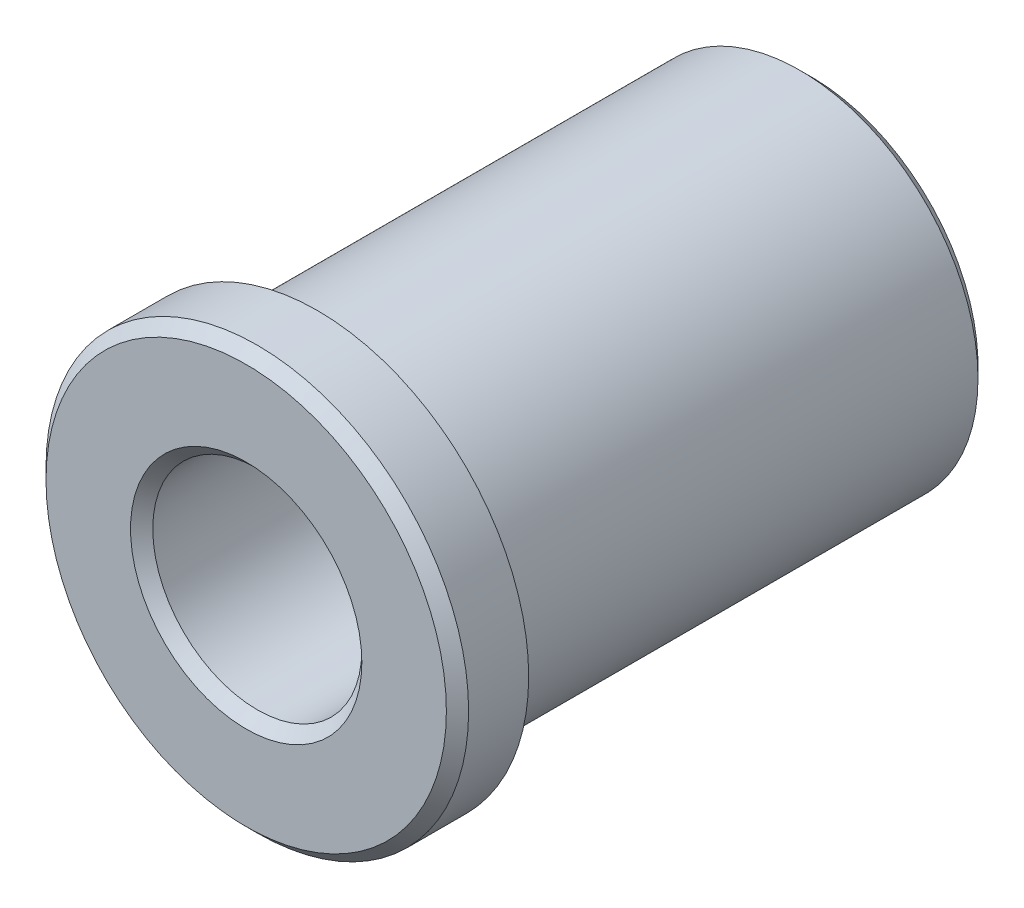
ISO-10303-21;
HEADER;
FILE_DESCRIPTION(('STEP AP214'),'2;1');
FILE_NAME('part.step','',(''),(''),'','','');
FILE_SCHEMA(('AUTOMOTIVE_DESIGN { 1 0 10303 214 1 1 1 1 }'));
ENDSEC;
DATA;
#1=APPLICATION_CONTEXT('core data for automotive mechanical design processes');
#2=APPLICATION_PROTOCOL_DEFINITION('international standard','automotive_design',2000,#1);
#3=PRODUCT_CONTEXT('',#1,'mechanical');
#4=PRODUCT('Part','Part','',(#3));
#5=PRODUCT_RELATED_PRODUCT_CATEGORY('part','',(#4));
#6=PRODUCT_DEFINITION_FORMATION('','',#4);
#7=PRODUCT_DEFINITION_CONTEXT('part definition',#1,'design');
#8=PRODUCT_DEFINITION('design','',#6,#7);
#9=PRODUCT_DEFINITION_SHAPE('','',#8);
#10=(LENGTH_UNIT() NAMED_UNIT(*) SI_UNIT(.MILLI.,.METRE.));
#11=(NAMED_UNIT(*) PLANE_ANGLE_UNIT() SI_UNIT($,.RADIAN.));
#12=(NAMED_UNIT(*) SI_UNIT($,.STERADIAN.) SOLID_ANGLE_UNIT());
#13=UNCERTAINTY_MEASURE_WITH_UNIT(LENGTH_MEASURE(1.E-05),#10,'distance_accuracy_value','');
#14=(GEOMETRIC_REPRESENTATION_CONTEXT(3) GLOBAL_UNCERTAINTY_ASSIGNED_CONTEXT((#13)) GLOBAL_UNIT_ASSIGNED_CONTEXT((#10,
#11,#12)) REPRESENTATION_CONTEXT('',''));
#15=CARTESIAN_POINT('',(0.,0.,0.));
#16=DIRECTION('',(0.,0.,1.));
#17=DIRECTION('',(1.,0.,0.));
#18=AXIS2_PLACEMENT_3D('',#15,#16,#17);
#19=CARTESIAN_POINT('',(0.,0.,0.));
#20=DIRECTION('',(0.,0.,1.));
#21=DIRECTION('',(1.,0.,0.));
#22=AXIS2_PLACEMENT_3D('',#19,#20,#21);
#23=CYLINDRICAL_SURFACE('',#22,2.35);
#24=CARTESIAN_POINT('',(0.,0.,-12.45));
#25=DIRECTION('',(0.,0.,-1.));
#26=DIRECTION('',(-1.,0.,0.));
#27=AXIS2_PLACEMENT_3D('',#24,#25,#26);
#28=CIRCLE('',#27,2.35);
#29=CARTESIAN_POINT('',(-2.35,0.,-12.45));
#30=VERTEX_POINT('',#29);
#31=EDGE_CURVE('E45',#30,#30,#28,.T.);
#32=ORIENTED_EDGE('',*,*,#31,.T.);
#33=EDGE_LOOP('',(#32));
#34=FACE_BOUND('',#33,.T.);
#35=CARTESIAN_POINT('',(0.,0.,-0.25));
#36=DIRECTION('',(0.,0.,1.));
#37=DIRECTION('',(1.,0.,0.));
#38=AXIS2_PLACEMENT_3D('',#35,#36,#37);
#39=CIRCLE('',#38,2.35);
#40=CARTESIAN_POINT('',(2.35,0.,-0.25));
#41=VERTEX_POINT('',#40);
#42=EDGE_CURVE('E50',#41,#41,#39,.T.);
#43=ORIENTED_EDGE('',*,*,#42,.T.);
#44=EDGE_LOOP('',(#43));
#45=FACE_BOUND('',#44,.T.);
#46=ADVANCED_FACE('F30',(#34,#45),#23,.F.);
#47=CARTESIAN_POINT('',(2.35,0.,0.));
#48=DIRECTION('',(0.,0.,1.));
#49=DIRECTION('',(1.,0.,0.));
#50=AXIS2_PLACEMENT_3D('',#47,#48,#49);
#51=PLANE('',#50);
#52=CARTESIAN_POINT('',(0.,0.,0.));
#53=DIRECTION('',(0.,0.,1.));
#54=DIRECTION('',(1.,0.,0.));
#55=AXIS2_PLACEMENT_3D('',#52,#53,#54);
#56=CIRCLE('',#55,2.6);
#57=CARTESIAN_POINT('',(2.6,0.,0.));
#58=VERTEX_POINT('',#57);
#59=EDGE_CURVE('E37',#58,#58,#56,.F.);
#60=ORIENTED_EDGE('',*,*,#59,.T.);
#61=EDGE_LOOP('',(#60));
#62=FACE_BOUND('',#61,.T.);
#63=CARTESIAN_POINT('',(0.,0.,0.));
#64=DIRECTION('',(0.,0.,1.));
#65=DIRECTION('',(1.,0.,0.));
#66=AXIS2_PLACEMENT_3D('',#63,#64,#65);
#67=CIRCLE('',#66,4.5);
#68=CARTESIAN_POINT('',(4.5,0.,0.));
#69=VERTEX_POINT('',#68);
#70=EDGE_CURVE('E41',#69,#69,#67,.T.);
#71=ORIENTED_EDGE('',*,*,#70,.T.);
#72=EDGE_LOOP('',(#71));
#73=FACE_BOUND('',#72,.T.);
#74=ADVANCED_FACE('F87',(#62,#73),#51,.T.);
#75=CARTESIAN_POINT('',(0.,0.,0.));
#76=DIRECTION('',(0.,0.,1.));
#77=DIRECTION('',(1.,0.,0.));
#78=AXIS2_PLACEMENT_3D('',#75,#76,#77);
#79=CYLINDRICAL_SURFACE('',#78,4.75);
#80=CARTESIAN_POINT('',(0.,0.,-0.250000000000002));
#81=DIRECTION('',(0.,0.,1.));
#82=DIRECTION('',(1.,0.,0.));
#83=AXIS2_PLACEMENT_3D('',#80,#81,#82);
#84=CIRCLE('',#83,4.75);
#85=CARTESIAN_POINT('',(4.75,0.,-0.250000000000002));
#86=VERTEX_POINT('',#85);
#87=EDGE_CURVE('E10',#86,#86,#84,.F.);
#88=ORIENTED_EDGE('',*,*,#87,.T.);
#89=EDGE_LOOP('',(#88));
#90=FACE_BOUND('',#89,.T.);
#91=CARTESIAN_POINT('',(0.,0.,-1.6));
#92=DIRECTION('',(0.,0.,1.));
#93=DIRECTION('',(1.,0.,0.));
#94=AXIS2_PLACEMENT_3D('',#91,#92,#93);
#95=CIRCLE('',#94,4.75);
#96=CARTESIAN_POINT('',(4.75,0.,-1.6));
#97=VERTEX_POINT('',#96);
#98=EDGE_CURVE('E62',#97,#97,#95,.T.);
#99=ORIENTED_EDGE('',*,*,#98,.T.);
#100=EDGE_LOOP('',(#99));
#101=FACE_BOUND('',#100,.T.);
#102=ADVANCED_FACE('F84',(#90,#101),#79,.T.);
#103=CARTESIAN_POINT('',(4.75,0.,-1.6));
#104=DIRECTION('',(0.,0.,-1.));
#105=DIRECTION('',(-1.,0.,0.));
#106=AXIS2_PLACEMENT_3D('',#103,#104,#105);
#107=PLANE('',#106);
#108=CARTESIAN_POINT('',(0.,0.,-1.6));
#109=DIRECTION('',(0.,0.,1.));
#110=DIRECTION('',(1.,0.,0.));
#111=AXIS2_PLACEMENT_3D('',#108,#109,#110);
#112=CIRCLE('',#111,4.);
#113=CARTESIAN_POINT('',(4.,0.,-1.6));
#114=VERTEX_POINT('',#113);
#115=EDGE_CURVE('E65',#114,#114,#112,.T.);
#116=ORIENTED_EDGE('',*,*,#115,.T.);
#117=EDGE_LOOP('',(#116));
#118=FACE_BOUND('',#117,.T.);
#119=ORIENTED_EDGE('',*,*,#98,.F.);
#120=EDGE_LOOP('',(#119));
#121=FACE_BOUND('',#120,.T.);
#122=ADVANCED_FACE('F69',(#118,#121),#107,.T.);
#123=CARTESIAN_POINT('',(0.,0.,0.));
#124=DIRECTION('',(0.,0.,1.));
#125=DIRECTION('',(1.,0.,0.));
#126=AXIS2_PLACEMENT_3D('',#123,#124,#125);
#127=CYLINDRICAL_SURFACE('',#126,4.);
#128=CARTESIAN_POINT('',(0.,0.,-12.45));
#129=DIRECTION('',(0.,0.,-1.));
#130=DIRECTION('',(-1.,0.,0.));
#131=AXIS2_PLACEMENT_3D('',#128,#129,#130);
#132=CIRCLE('',#131,4.);
#133=CARTESIAN_POINT('',(-4.,0.,-12.45));
#134=VERTEX_POINT('',#133);
#135=EDGE_CURVE('E59',#134,#134,#132,.F.);
#136=ORIENTED_EDGE('',*,*,#135,.T.);
#137=EDGE_LOOP('',(#136));
#138=FACE_BOUND('',#137,.T.);
#139=ORIENTED_EDGE('',*,*,#115,.F.);
#140=EDGE_LOOP('',(#139));
#141=FACE_BOUND('',#140,.T.);
#142=ADVANCED_FACE('F72',(#138,#141),#127,.T.);
#143=CARTESIAN_POINT('',(4.,0.,-12.7));
#144=DIRECTION('',(0.,0.,-1.));
#145=DIRECTION('',(-1.,0.,0.));
#146=AXIS2_PLACEMENT_3D('',#143,#144,#145);
#147=PLANE('',#146);
#148=CARTESIAN_POINT('',(0.,0.,-12.7));
#149=DIRECTION('',(0.,0.,-1.));
#150=DIRECTION('',(-1.,0.,0.));
#151=AXIS2_PLACEMENT_3D('',#148,#149,#150);
#152=CIRCLE('',#151,3.75);
#153=CARTESIAN_POINT('',(-3.75,0.,-12.7));
#154=VERTEX_POINT('',#153);
#155=EDGE_CURVE('E53',#154,#154,#152,.T.);
#156=ORIENTED_EDGE('',*,*,#155,.T.);
#157=EDGE_LOOP('',(#156));
#158=FACE_BOUND('',#157,.T.);
#159=CARTESIAN_POINT('',(0.,0.,-12.7));
#160=DIRECTION('',(0.,0.,-1.));
#161=DIRECTION('',(-1.,0.,0.));
#162=AXIS2_PLACEMENT_3D('',#159,#160,#161);
#163=CIRCLE('',#162,2.6);
#164=CARTESIAN_POINT('',(-2.6,0.,-12.7));
#165=VERTEX_POINT('',#164);
#166=EDGE_CURVE('E56',#165,#165,#163,.F.);
#167=ORIENTED_EDGE('',*,*,#166,.T.);
#168=EDGE_LOOP('',(#167));
#169=FACE_BOUND('',#168,.T.);
#170=ADVANCED_FACE('F74',(#158,#169),#147,.T.);
#171=CARTESIAN_POINT('',(0.,0.,-12.45));
#172=DIRECTION('',(0.,0.,1.));
#173=DIRECTION('',(1.,0.,0.));
#174=AXIS2_PLACEMENT_3D('',#171,#172,#173);
#175=CONICAL_SURFACE('',#174,4.,0.785398163397448);
#176=ORIENTED_EDGE('',*,*,#155,.F.);
#177=EDGE_LOOP('',(#176));
#178=FACE_BOUND('',#177,.T.);
#179=ORIENTED_EDGE('',*,*,#135,.F.);
#180=EDGE_LOOP('',(#179));
#181=FACE_BOUND('',#180,.T.);
#182=ADVANCED_FACE('F81',(#178,#181),#175,.T.);
#183=CARTESIAN_POINT('',(0.,0.,-12.7));
#184=DIRECTION('',(0.,0.,-1.));
#185=DIRECTION('',(-1.,0.,0.));
#186=AXIS2_PLACEMENT_3D('',#183,#184,#185);
#187=CONICAL_SURFACE('',#186,2.6,0.785398163397443);
#188=ORIENTED_EDGE('',*,*,#31,.F.);
#189=EDGE_LOOP('',(#188));
#190=FACE_BOUND('',#189,.T.);
#191=ORIENTED_EDGE('',*,*,#166,.F.);
#192=EDGE_LOOP('',(#191));
#193=FACE_BOUND('',#192,.T.);
#194=ADVANCED_FACE('F99',(#190,#193),#187,.F.);
#195=CARTESIAN_POINT('',(0.,0.,-0.25));
#196=DIRECTION('',(0.,0.,1.));
#197=DIRECTION('',(1.,0.,0.));
#198=AXIS2_PLACEMENT_3D('',#195,#196,#197);
#199=CONICAL_SURFACE('',#198,2.35,0.785398163397447);
#200=ORIENTED_EDGE('',*,*,#59,.F.);
#201=EDGE_LOOP('',(#200));
#202=FACE_BOUND('',#201,.T.);
#203=ORIENTED_EDGE('',*,*,#42,.F.);
#204=EDGE_LOOP('',(#203));
#205=FACE_BOUND('',#204,.T.);
#206=ADVANCED_FACE('F102',(#202,#205),#199,.F.);
#207=CARTESIAN_POINT('',(0.,0.,0.));
#208=DIRECTION('',(0.,0.,-1.));
#209=DIRECTION('',(-1.,0.,0.));
#210=AXIS2_PLACEMENT_3D('',#207,#208,#209);
#211=CONICAL_SURFACE('',#210,4.5,0.785398163397447);
#212=ORIENTED_EDGE('',*,*,#87,.F.);
#213=EDGE_LOOP('',(#212));
#214=FACE_BOUND('',#213,.T.);
#215=ORIENTED_EDGE('',*,*,#70,.F.);
#216=EDGE_LOOP('',(#215));
#217=FACE_BOUND('',#216,.T.);
#218=ADVANCED_FACE('F32',(#214,#217),#211,.T.);
#219=CLOSED_SHELL('',(#46,#74,#102,#122,#142,#170,#182,#194,#206,#218));
#220=MANIFOLD_SOLID_BREP('B2',#219);
#221=ADVANCED_BREP_SHAPE_REPRESENTATION('',(#18,#220),#14);
#222=SHAPE_DEFINITION_REPRESENTATION(#9,#221);
ENDSEC;
END-ISO-10303-21;
